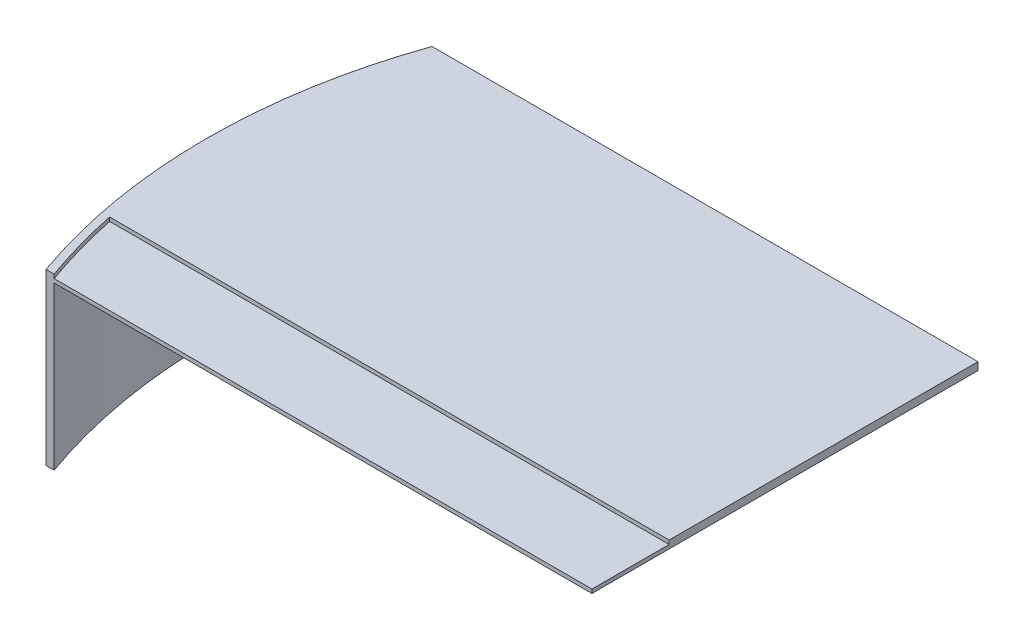
ISO-10303-21;
HEADER;
FILE_DESCRIPTION(('STEP AP214'),'2;1');
FILE_NAME('part.step','',(''),(''),'','','');
FILE_SCHEMA(('AUTOMOTIVE_DESIGN { 1 0 10303 214 1 1 1 1 }'));
ENDSEC;
DATA;
#1=APPLICATION_CONTEXT('core data for automotive mechanical design processes');
#2=APPLICATION_PROTOCOL_DEFINITION('international standard','automotive_design',2000,#1);
#3=PRODUCT_CONTEXT('',#1,'mechanical');
#4=PRODUCT('Part','Part','',(#3));
#5=PRODUCT_RELATED_PRODUCT_CATEGORY('part','',(#4));
#6=PRODUCT_DEFINITION_FORMATION('','',#4);
#7=PRODUCT_DEFINITION_CONTEXT('part definition',#1,'design');
#8=PRODUCT_DEFINITION('design','',#6,#7);
#9=PRODUCT_DEFINITION_SHAPE('','',#8);
#10=(LENGTH_UNIT() NAMED_UNIT(*) SI_UNIT(.MILLI.,.METRE.));
#11=(NAMED_UNIT(*) PLANE_ANGLE_UNIT() SI_UNIT($,.RADIAN.));
#12=(NAMED_UNIT(*) SI_UNIT($,.STERADIAN.) SOLID_ANGLE_UNIT());
#13=UNCERTAINTY_MEASURE_WITH_UNIT(LENGTH_MEASURE(1.E-05),#10,'distance_accuracy_value','');
#14=(GEOMETRIC_REPRESENTATION_CONTEXT(3) GLOBAL_UNCERTAINTY_ASSIGNED_CONTEXT((#13)) GLOBAL_UNIT_ASSIGNED_CONTEXT((#10,
#11,#12)) REPRESENTATION_CONTEXT('',''));
#15=CARTESIAN_POINT('',(0.,0.,0.));
#16=DIRECTION('',(0.,0.,1.));
#17=DIRECTION('',(1.,0.,0.));
#18=AXIS2_PLACEMENT_3D('',#15,#16,#17);
#19=CARTESIAN_POINT('',(0.,44.,-50.));
#20=DIRECTION('',(0.,0.,1.));
#21=DIRECTION('',(1.,0.,0.));
#22=AXIS2_PLACEMENT_3D('',#19,#20,#21);
#23=PLANE('',#22);
#24=DIRECTION('',(-1.,0.,0.));
#25=VECTOR('',#24,1.);
#26=CARTESIAN_POINT('',(0.,42.,-50.));
#27=LINE('',#26,#25);
#28=CARTESIAN_POINT('',(0.,42.,-50.));
#29=VERTEX_POINT('',#28);
#30=CARTESIAN_POINT('',(-139.298241194927,42.,-50.));
#31=VERTEX_POINT('',#30);
#32=EDGE_CURVE('E136',#29,#31,#27,.T.);
#33=ORIENTED_EDGE('',*,*,#32,.T.);
#34=DIRECTION('',(0.,-1.,0.));
#35=VECTOR('',#34,1.);
#36=CARTESIAN_POINT('',(-139.298241194927,42.,-50.));
#37=LINE('',#36,#35);
#38=CARTESIAN_POINT('',(-139.298241194927,0.,-50.));
#39=VERTEX_POINT('',#38);
#40=EDGE_CURVE('E139',#31,#39,#37,.T.);
#41=ORIENTED_EDGE('',*,*,#40,.T.);
#42=DIRECTION('',(-1.,0.,0.));
#43=VECTOR('',#42,1.);
#44=CARTESIAN_POINT('',(0.,0.,-50.));
#45=LINE('',#44,#43);
#46=CARTESIAN_POINT('',(-141.42135623731,0.,-50.));
#47=VERTEX_POINT('',#46);
#48=EDGE_CURVE('E142',#39,#47,#45,.T.);
#49=ORIENTED_EDGE('',*,*,#48,.T.);
#50=DIRECTION('',(0.,-1.,0.));
#51=VECTOR('',#50,1.);
#52=CARTESIAN_POINT('',(-141.42135623731,44.,-50.));
#53=LINE('',#52,#51);
#54=CARTESIAN_POINT('',(-141.42135623731,44.,-50.));
#55=VERTEX_POINT('',#54);
#56=EDGE_CURVE('E40',#55,#47,#53,.T.);
#57=ORIENTED_EDGE('',*,*,#56,.F.);
#58=DIRECTION('',(-1.,0.,0.));
#59=VECTOR('',#58,1.);
#60=CARTESIAN_POINT('',(0.,44.,-50.));
#61=LINE('',#60,#59);
#62=CARTESIAN_POINT('',(0.,44.,-50.));
#63=VERTEX_POINT('',#62);
#64=EDGE_CURVE('E152',#63,#55,#61,.T.);
#65=ORIENTED_EDGE('',*,*,#64,.F.);
#66=DIRECTION('',(0.,-1.,0.));
#67=VECTOR('',#66,1.);
#68=CARTESIAN_POINT('',(0.,44.,-50.));
#69=LINE('',#68,#67);
#70=EDGE_CURVE('E11',#63,#29,#69,.T.);
#71=ORIENTED_EDGE('',*,*,#70,.T.);
#72=EDGE_LOOP('',(#33,#41,#49,#57,#65,#71));
#73=FACE_BOUND('',#72,.T.);
#74=ADVANCED_FACE('F33',(#73),#23,.F.);
#75=CARTESIAN_POINT('',(0.,44.,0.));
#76=DIRECTION('',(0.,-1.,0.));
#77=DIRECTION('',(0.,0.,-1.));
#78=AXIS2_PLACEMENT_3D('',#75,#76,#77);
#79=CYLINDRICAL_SURFACE('',#78,150.);
#80=CARTESIAN_POINT('',(0.,0.,0.));
#81=DIRECTION('',(0.,1.,0.));
#82=DIRECTION('',(0.,0.,1.));
#83=AXIS2_PLACEMENT_3D('',#80,#81,#82);
#84=CIRCLE('',#83,150.);
#85=CARTESIAN_POINT('',(-141.42135623731,0.,50.));
#86=VERTEX_POINT('',#85);
#87=EDGE_CURVE('E162',#47,#86,#84,.T.);
#88=ORIENTED_EDGE('',*,*,#87,.T.);
#89=DIRECTION('',(0.,-1.,0.));
#90=VECTOR('',#89,1.);
#91=CARTESIAN_POINT('',(-141.42135623731,44.,50.));
#92=LINE('',#91,#90);
#93=CARTESIAN_POINT('',(-141.42135623731,44.,50.));
#94=VERTEX_POINT('',#93);
#95=EDGE_CURVE('E167',#94,#86,#92,.T.);
#96=ORIENTED_EDGE('',*,*,#95,.F.);
#97=CARTESIAN_POINT('',(0.,44.,0.));
#98=DIRECTION('',(0.,1.,0.));
#99=DIRECTION('',(0.,0.,1.));
#100=AXIS2_PLACEMENT_3D('',#97,#98,#99);
#101=CIRCLE('',#100,150.);
#102=EDGE_CURVE('E155',#55,#94,#101,.T.);
#103=ORIENTED_EDGE('',*,*,#102,.F.);
#104=ORIENTED_EDGE('',*,*,#56,.T.);
#105=EDGE_LOOP('',(#88,#96,#103,#104));
#106=FACE_BOUND('',#105,.T.);
#107=ADVANCED_FACE('F174',(#106),#79,.T.);
#108=CARTESIAN_POINT('',(0.,44.,50.));
#109=DIRECTION('',(0.,0.,-1.));
#110=DIRECTION('',(-1.,0.,0.));
#111=AXIS2_PLACEMENT_3D('',#108,#109,#110);
#112=PLANE('',#111);
#113=DIRECTION('',(1.,0.,0.));
#114=VECTOR('',#113,1.);
#115=CARTESIAN_POINT('',(-215.364457980039,43.,50.));
#116=LINE('',#115,#114);
#117=CARTESIAN_POINT('',(-139.298241194927,43.,50.));
#118=VERTEX_POINT('',#117);
#119=CARTESIAN_POINT('',(0.,43.,50.));
#120=VERTEX_POINT('',#119);
#121=EDGE_CURVE('E117',#118,#120,#116,.T.);
#122=ORIENTED_EDGE('',*,*,#121,.F.);
#123=DIRECTION('',(0.,1.,0.));
#124=VECTOR('',#123,1.);
#125=CARTESIAN_POINT('',(-139.298241194927,43.,50.));
#126=LINE('',#125,#124);
#127=CARTESIAN_POINT('',(-139.298241194927,44.,50.));
#128=VERTEX_POINT('',#127);
#129=EDGE_CURVE('E108',#118,#128,#126,.T.);
#130=ORIENTED_EDGE('',*,*,#129,.T.);
#131=DIRECTION('',(1.,0.,0.));
#132=VECTOR('',#131,1.);
#133=CARTESIAN_POINT('',(0.,44.,50.));
#134=LINE('',#133,#132);
#135=EDGE_CURVE('E157',#94,#128,#134,.T.);
#136=ORIENTED_EDGE('',*,*,#135,.F.);
#137=ORIENTED_EDGE('',*,*,#95,.T.);
#138=DIRECTION('',(1.,0.,0.));
#139=VECTOR('',#138,1.);
#140=CARTESIAN_POINT('',(0.,0.,50.));
#141=LINE('',#140,#139);
#142=CARTESIAN_POINT('',(-139.298241194927,0.,50.));
#143=VERTEX_POINT('',#142);
#144=EDGE_CURVE('E153',#86,#143,#141,.T.);
#145=ORIENTED_EDGE('',*,*,#144,.T.);
#146=DIRECTION('',(0.,-1.,0.));
#147=VECTOR('',#146,1.);
#148=CARTESIAN_POINT('',(-139.298241194927,42.,50.));
#149=LINE('',#148,#147);
#150=CARTESIAN_POINT('',(-139.298241194927,42.,50.));
#151=VERTEX_POINT('',#150);
#152=EDGE_CURVE('E55',#151,#143,#149,.T.);
#153=ORIENTED_EDGE('',*,*,#152,.F.);
#154=DIRECTION('',(1.,0.,0.));
#155=VECTOR('',#154,1.);
#156=CARTESIAN_POINT('',(0.,42.,50.));
#157=LINE('',#156,#155);
#158=CARTESIAN_POINT('',(0.,42.,50.));
#159=VERTEX_POINT('',#158);
#160=EDGE_CURVE('E135',#151,#159,#157,.T.);
#161=ORIENTED_EDGE('',*,*,#160,.T.);
#162=DIRECTION('',(0.,-1.,0.));
#163=VECTOR('',#162,1.);
#164=CARTESIAN_POINT('',(0.,44.,50.));
#165=LINE('',#164,#163);
#166=EDGE_CURVE('E160',#120,#159,#165,.T.);
#167=ORIENTED_EDGE('',*,*,#166,.F.);
#168=EDGE_LOOP('',(#122,#130,#136,#137,#145,#153,#161,#167));
#169=FACE_BOUND('',#168,.T.);
#170=ADVANCED_FACE('F183',(#169),#112,.F.);
#171=CARTESIAN_POINT('',(0.,44.,0.));
#172=DIRECTION('',(-1.,0.,0.));
#173=DIRECTION('',(0.,0.,1.));
#174=AXIS2_PLACEMENT_3D('',#171,#172,#173);
#175=PLANE('',#174);
#176=DIRECTION('',(0.,0.,-1.));
#177=VECTOR('',#176,1.);
#178=CARTESIAN_POINT('',(0.,44.,0.));
#179=LINE('',#178,#177);
#180=CARTESIAN_POINT('',(0.,44.,30.));
#181=VERTEX_POINT('',#180);
#182=EDGE_CURVE('E150',#181,#63,#179,.T.);
#183=ORIENTED_EDGE('',*,*,#182,.F.);
#184=DIRECTION('',(0.,1.,0.));
#185=VECTOR('',#184,1.);
#186=CARTESIAN_POINT('',(0.,43.,30.));
#187=LINE('',#186,#185);
#188=CARTESIAN_POINT('',(0.,43.,30.));
#189=VERTEX_POINT('',#188);
#190=EDGE_CURVE('E129',#189,#181,#187,.T.);
#191=ORIENTED_EDGE('',*,*,#190,.F.);
#192=DIRECTION('',(0.,0.,-1.));
#193=VECTOR('',#192,1.);
#194=CARTESIAN_POINT('',(0.,43.,0.));
#195=LINE('',#194,#193);
#196=EDGE_CURVE('E109',#120,#189,#195,.T.);
#197=ORIENTED_EDGE('',*,*,#196,.F.);
#198=ORIENTED_EDGE('',*,*,#166,.T.);
#199=DIRECTION('',(0.,0.,-1.));
#200=VECTOR('',#199,1.);
#201=CARTESIAN_POINT('',(0.,42.,0.));
#202=LINE('',#201,#200);
#203=EDGE_CURVE('E138',#159,#29,#202,.T.);
#204=ORIENTED_EDGE('',*,*,#203,.T.);
#205=ORIENTED_EDGE('',*,*,#70,.F.);
#206=EDGE_LOOP('',(#183,#191,#197,#198,#204,#205));
#207=FACE_BOUND('',#206,.T.);
#208=ADVANCED_FACE('F190',(#207),#175,.F.);
#209=CARTESIAN_POINT('',(0.,44.,0.));
#210=DIRECTION('',(0.,1.,0.));
#211=DIRECTION('',(0.,0.,1.));
#212=AXIS2_PLACEMENT_3D('',#209,#210,#211);
#213=PLANE('',#212);
#214=DIRECTION('',(-1.,0.,0.));
#215=VECTOR('',#214,1.);
#216=CARTESIAN_POINT('',(-215.364457980039,44.,30.));
#217=LINE('',#216,#215);
#218=CARTESIAN_POINT('',(-144.927568115939,44.,30.));
#219=VERTEX_POINT('',#218);
#220=EDGE_CURVE('E47',#181,#219,#217,.T.);
#221=ORIENTED_EDGE('',*,*,#220,.F.);
#222=ORIENTED_EDGE('',*,*,#182,.T.);
#223=ORIENTED_EDGE('',*,*,#64,.T.);
#224=ORIENTED_EDGE('',*,*,#102,.T.);
#225=ORIENTED_EDGE('',*,*,#135,.T.);
#226=CARTESIAN_POINT('',(4.08284517305901E-11,44.,-1.14908083048704E-11));
#227=DIRECTION('',(0.,1.,0.));
#228=DIRECTION('',(0.,0.,1.));
#229=AXIS2_PLACEMENT_3D('',#226,#227,#228);
#230=CIRCLE('',#229,148.000000000042);
#231=EDGE_CURVE('E122',#219,#128,#230,.T.);
#232=ORIENTED_EDGE('',*,*,#231,.F.);
#233=EDGE_LOOP('',(#221,#222,#223,#224,#225,#232));
#234=FACE_BOUND('',#233,.T.);
#235=ADVANCED_FACE('F186',(#234),#213,.T.);
#236=CARTESIAN_POINT('',(0.,0.,0.));
#237=DIRECTION('',(0.,1.,0.));
#238=DIRECTION('',(0.,0.,1.));
#239=AXIS2_PLACEMENT_3D('',#236,#237,#238);
#240=PLANE('',#239);
#241=ORIENTED_EDGE('',*,*,#48,.F.);
#242=CARTESIAN_POINT('',(0.,0.,0.));
#243=DIRECTION('',(0.,1.,0.));
#244=DIRECTION('',(0.,0.,1.));
#245=AXIS2_PLACEMENT_3D('',#242,#243,#244);
#246=CIRCLE('',#245,148.);
#247=EDGE_CURVE('E131',#39,#143,#246,.T.);
#248=ORIENTED_EDGE('',*,*,#247,.T.);
#249=ORIENTED_EDGE('',*,*,#144,.F.);
#250=ORIENTED_EDGE('',*,*,#87,.F.);
#251=EDGE_LOOP('',(#241,#248,#249,#250));
#252=FACE_BOUND('',#251,.T.);
#253=ADVANCED_FACE('F181',(#252),#240,.F.);
#254=CARTESIAN_POINT('',(0.,44.,0.));
#255=DIRECTION('',(0.,-1.,0.));
#256=DIRECTION('',(0.,0.,-1.));
#257=AXIS2_PLACEMENT_3D('',#254,#255,#256);
#258=CYLINDRICAL_SURFACE('',#257,148.);
#259=ORIENTED_EDGE('',*,*,#247,.F.);
#260=ORIENTED_EDGE('',*,*,#40,.F.);
#261=CARTESIAN_POINT('',(0.,42.,0.));
#262=DIRECTION('',(0.,1.,0.));
#263=DIRECTION('',(0.,0.,1.));
#264=AXIS2_PLACEMENT_3D('',#261,#262,#263);
#265=CIRCLE('',#264,148.);
#266=EDGE_CURVE('E133',#31,#151,#265,.T.);
#267=ORIENTED_EDGE('',*,*,#266,.T.);
#268=ORIENTED_EDGE('',*,*,#152,.T.);
#269=EDGE_LOOP('',(#259,#260,#267,#268));
#270=FACE_BOUND('',#269,.T.);
#271=ADVANCED_FACE('F197',(#270),#258,.F.);
#272=CARTESIAN_POINT('',(0.,42.,0.));
#273=DIRECTION('',(0.,1.,0.));
#274=DIRECTION('',(0.,0.,1.));
#275=AXIS2_PLACEMENT_3D('',#272,#273,#274);
#276=PLANE('',#275);
#277=ORIENTED_EDGE('',*,*,#203,.F.);
#278=ORIENTED_EDGE('',*,*,#160,.F.);
#279=ORIENTED_EDGE('',*,*,#266,.F.);
#280=ORIENTED_EDGE('',*,*,#32,.F.);
#281=EDGE_LOOP('',(#277,#278,#279,#280));
#282=FACE_BOUND('',#281,.T.);
#283=ADVANCED_FACE('F195',(#282),#276,.F.);
#284=CARTESIAN_POINT('',(-215.364457980039,43.,30.));
#285=DIRECTION('',(0.,0.,-1.));
#286=DIRECTION('',(-1.,0.,0.));
#287=AXIS2_PLACEMENT_3D('',#284,#285,#286);
#288=PLANE('',#287);
#289=ORIENTED_EDGE('',*,*,#220,.T.);
#290=DIRECTION('',(0.,1.,0.));
#291=VECTOR('',#290,1.);
#292=CARTESIAN_POINT('',(-144.927568115939,43.,30.));
#293=LINE('',#292,#291);
#294=CARTESIAN_POINT('',(-144.927568115939,43.,30.));
#295=VERTEX_POINT('',#294);
#296=EDGE_CURVE('E100',#295,#219,#293,.T.);
#297=ORIENTED_EDGE('',*,*,#296,.F.);
#298=DIRECTION('',(-1.,0.,0.));
#299=VECTOR('',#298,1.);
#300=CARTESIAN_POINT('',(-215.364457980039,43.,30.));
#301=LINE('',#300,#299);
#302=EDGE_CURVE('E104',#189,#295,#301,.T.);
#303=ORIENTED_EDGE('',*,*,#302,.F.);
#304=ORIENTED_EDGE('',*,*,#190,.T.);
#305=EDGE_LOOP('',(#289,#297,#303,#304));
#306=FACE_BOUND('',#305,.T.);
#307=ADVANCED_FACE('F102',(#306),#288,.F.);
#308=CARTESIAN_POINT('',(4.08284517305901E-11,43.,-1.14908083048704E-11));
#309=DIRECTION('',(0.,1.,0.));
#310=DIRECTION('',(0.,0.,1.));
#311=AXIS2_PLACEMENT_3D('',#308,#309,#310);
#312=CYLINDRICAL_SURFACE('',#311,148.000000000042);
#313=ORIENTED_EDGE('',*,*,#231,.T.);
#314=ORIENTED_EDGE('',*,*,#129,.F.);
#315=CARTESIAN_POINT('',(4.08284517305901E-11,43.,-1.14908083048704E-11));
#316=DIRECTION('',(0.,1.,0.));
#317=DIRECTION('',(0.,0.,1.));
#318=AXIS2_PLACEMENT_3D('',#315,#316,#317);
#319=CIRCLE('',#318,148.000000000042);
#320=EDGE_CURVE('E112',#295,#118,#319,.T.);
#321=ORIENTED_EDGE('',*,*,#320,.F.);
#322=ORIENTED_EDGE('',*,*,#296,.T.);
#323=EDGE_LOOP('',(#313,#314,#321,#322));
#324=FACE_BOUND('',#323,.T.);
#325=ADVANCED_FACE('F113',(#324),#312,.F.);
#326=CARTESIAN_POINT('',(-215.364457980039,43.,0.));
#327=DIRECTION('',(0.,1.,0.));
#328=DIRECTION('',(0.,0.,1.));
#329=AXIS2_PLACEMENT_3D('',#326,#327,#328);
#330=PLANE('',#329);
#331=ORIENTED_EDGE('',*,*,#302,.T.);
#332=ORIENTED_EDGE('',*,*,#320,.T.);
#333=ORIENTED_EDGE('',*,*,#121,.T.);
#334=ORIENTED_EDGE('',*,*,#196,.T.);
#335=EDGE_LOOP('',(#331,#332,#333,#334));
#336=FACE_BOUND('',#335,.T.);
#337=ADVANCED_FACE('F119',(#336),#330,.T.);
#338=CLOSED_SHELL('',(#74,#107,#170,#208,#235,#253,#271,#283,#307,#325,#337));
#339=MANIFOLD_SOLID_BREP('B2',#338);
#340=ADVANCED_BREP_SHAPE_REPRESENTATION('',(#18,#339),#14);
#341=SHAPE_DEFINITION_REPRESENTATION(#9,#340);
ENDSEC;
END-ISO-10303-21;
